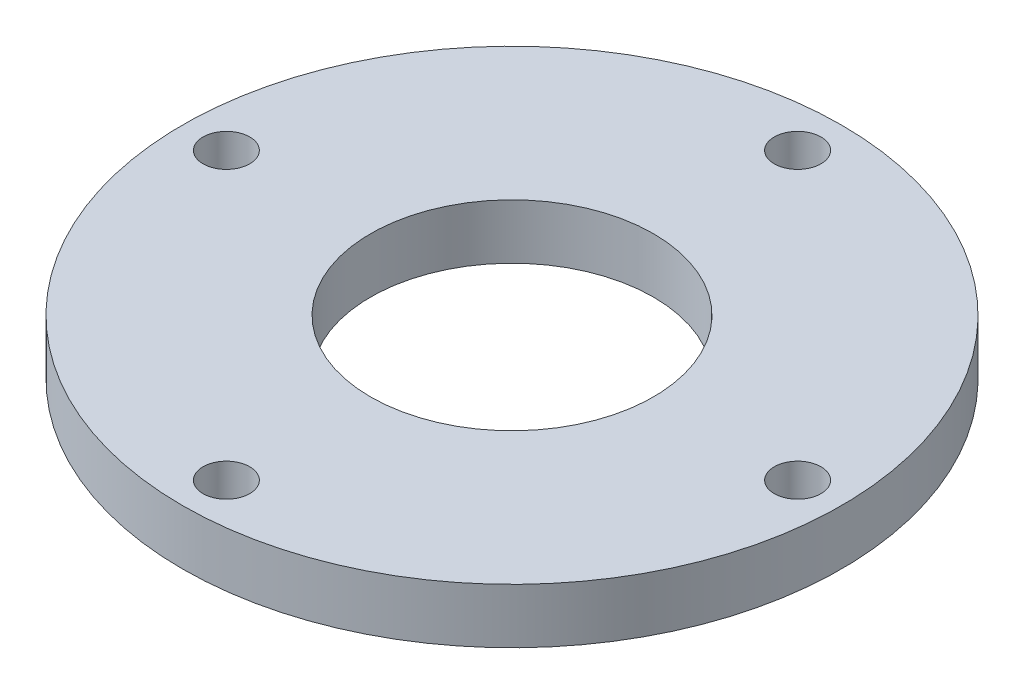
ISO-10303-21;
HEADER;
FILE_DESCRIPTION(('STEP AP214'),'2;1');
FILE_NAME('part.step','',(''),(''),'','','');
FILE_SCHEMA(('AUTOMOTIVE_DESIGN { 1 0 10303 214 1 1 1 1 }'));
ENDSEC;
DATA;
#1=APPLICATION_CONTEXT('core data for automotive mechanical design processes');
#2=APPLICATION_PROTOCOL_DEFINITION('international standard','automotive_design',2000,#1);
#3=PRODUCT_CONTEXT('',#1,'mechanical');
#4=PRODUCT('Part','Part','',(#3));
#5=PRODUCT_RELATED_PRODUCT_CATEGORY('part','',(#4));
#6=PRODUCT_DEFINITION_FORMATION('','',#4);
#7=PRODUCT_DEFINITION_CONTEXT('part definition',#1,'design');
#8=PRODUCT_DEFINITION('design','',#6,#7);
#9=PRODUCT_DEFINITION_SHAPE('','',#8);
#10=(LENGTH_UNIT() NAMED_UNIT(*) SI_UNIT(.MILLI.,.METRE.));
#11=(NAMED_UNIT(*) PLANE_ANGLE_UNIT() SI_UNIT($,.RADIAN.));
#12=(NAMED_UNIT(*) SI_UNIT($,.STERADIAN.) SOLID_ANGLE_UNIT());
#13=UNCERTAINTY_MEASURE_WITH_UNIT(LENGTH_MEASURE(1.E-05),#10,'distance_accuracy_value','');
#14=(GEOMETRIC_REPRESENTATION_CONTEXT(3) GLOBAL_UNCERTAINTY_ASSIGNED_CONTEXT((#13)) GLOBAL_UNIT_ASSIGNED_CONTEXT((#10,
#11,#12)) REPRESENTATION_CONTEXT('',''));
#15=CARTESIAN_POINT('',(0.,0.,0.));
#16=DIRECTION('',(0.,0.,1.));
#17=DIRECTION('',(1.,0.,0.));
#18=AXIS2_PLACEMENT_3D('',#15,#16,#17);
#19=CARTESIAN_POINT('',(0.,4.,0.));
#20=DIRECTION('',(0.,1.,0.));
#21=DIRECTION('',(0.,0.,1.));
#22=AXIS2_PLACEMENT_3D('',#19,#20,#21);
#23=PLANE('',#22);
#24=CARTESIAN_POINT('',(-20.8,4.,0.));
#25=DIRECTION('',(0.,1.,0.));
#26=DIRECTION('',(0.,0.,1.));
#27=AXIS2_PLACEMENT_3D('',#24,#25,#26);
#28=CIRCLE('',#27,1.7);
#29=CARTESIAN_POINT('',(-20.8,4.,1.7));
#30=VERTEX_POINT('',#29);
#31=EDGE_CURVE('E76',#30,#30,#28,.T.);
#32=ORIENTED_EDGE('',*,*,#31,.F.);
#33=EDGE_LOOP('',(#32));
#34=FACE_BOUND('',#33,.T.);
#35=CARTESIAN_POINT('',(0.,4.,-20.8));
#36=DIRECTION('',(0.,1.,0.));
#37=DIRECTION('',(0.,0.,1.));
#38=AXIS2_PLACEMENT_3D('',#35,#36,#37);
#39=CIRCLE('',#38,1.7);
#40=CARTESIAN_POINT('',(0.,4.,-19.1));
#41=VERTEX_POINT('',#40);
#42=EDGE_CURVE('E73',#41,#41,#39,.T.);
#43=ORIENTED_EDGE('',*,*,#42,.F.);
#44=EDGE_LOOP('',(#43));
#45=FACE_BOUND('',#44,.T.);
#46=CARTESIAN_POINT('',(20.8,4.,0.));
#47=DIRECTION('',(0.,1.,0.));
#48=DIRECTION('',(0.,0.,1.));
#49=AXIS2_PLACEMENT_3D('',#46,#47,#48);
#50=CIRCLE('',#49,1.7);
#51=CARTESIAN_POINT('',(20.8,4.,1.7));
#52=VERTEX_POINT('',#51);
#53=EDGE_CURVE('E67',#52,#52,#50,.T.);
#54=ORIENTED_EDGE('',*,*,#53,.F.);
#55=EDGE_LOOP('',(#54));
#56=FACE_BOUND('',#55,.T.);
#57=CARTESIAN_POINT('',(0.,4.,20.8));
#58=DIRECTION('',(0.,1.,0.));
#59=DIRECTION('',(0.,0.,1.));
#60=AXIS2_PLACEMENT_3D('',#57,#58,#59);
#61=CIRCLE('',#60,1.7);
#62=CARTESIAN_POINT('',(0.,4.,22.5));
#63=VERTEX_POINT('',#62);
#64=EDGE_CURVE('E61',#63,#63,#61,.T.);
#65=ORIENTED_EDGE('',*,*,#64,.F.);
#66=EDGE_LOOP('',(#65));
#67=FACE_BOUND('',#66,.T.);
#68=CARTESIAN_POINT('',(0.,4.,0.));
#69=DIRECTION('',(0.,1.,0.));
#70=DIRECTION('',(0.,0.,1.));
#71=AXIS2_PLACEMENT_3D('',#68,#69,#70);
#72=CIRCLE('',#71,24.);
#73=CARTESIAN_POINT('',(0.,4.,24.));
#74=VERTEX_POINT('',#73);
#75=EDGE_CURVE('E10',#74,#74,#72,.T.);
#76=ORIENTED_EDGE('',*,*,#75,.T.);
#77=EDGE_LOOP('',(#76));
#78=FACE_BOUND('',#77,.T.);
#79=CARTESIAN_POINT('',(0.,4.,0.));
#80=DIRECTION('',(0.,1.,0.));
#81=DIRECTION('',(0.,0.,1.));
#82=AXIS2_PLACEMENT_3D('',#79,#80,#81);
#83=CIRCLE('',#82,10.3);
#84=CARTESIAN_POINT('',(0.,4.,10.3));
#85=VERTEX_POINT('',#84);
#86=EDGE_CURVE('E50',#85,#85,#83,.T.);
#87=ORIENTED_EDGE('',*,*,#86,.F.);
#88=EDGE_LOOP('',(#87));
#89=FACE_BOUND('',#88,.T.);
#90=ADVANCED_FACE('F39',(#34,#45,#56,#67,#78,#89),#23,.T.);
#91=CARTESIAN_POINT('',(0.,0.,0.));
#92=DIRECTION('',(0.,1.,0.));
#93=DIRECTION('',(0.,0.,1.));
#94=AXIS2_PLACEMENT_3D('',#91,#92,#93);
#95=PLANE('',#94);
#96=CARTESIAN_POINT('',(-20.8,0.,0.));
#97=DIRECTION('',(0.,1.,0.));
#98=DIRECTION('',(0.,0.,1.));
#99=AXIS2_PLACEMENT_3D('',#96,#97,#98);
#100=CIRCLE('',#99,1.7);
#101=CARTESIAN_POINT('',(-20.8,0.,1.7));
#102=VERTEX_POINT('',#101);
#103=EDGE_CURVE('E55',#102,#102,#100,.T.);
#104=ORIENTED_EDGE('',*,*,#103,.T.);
#105=EDGE_LOOP('',(#104));
#106=FACE_BOUND('',#105,.T.);
#107=CARTESIAN_POINT('',(0.,0.,-20.8));
#108=DIRECTION('',(0.,1.,0.));
#109=DIRECTION('',(0.,0.,1.));
#110=AXIS2_PLACEMENT_3D('',#107,#108,#109);
#111=CIRCLE('',#110,1.7);
#112=CARTESIAN_POINT('',(0.,0.,-19.1));
#113=VERTEX_POINT('',#112);
#114=EDGE_CURVE('E70',#113,#113,#111,.T.);
#115=ORIENTED_EDGE('',*,*,#114,.T.);
#116=EDGE_LOOP('',(#115));
#117=FACE_BOUND('',#116,.T.);
#118=CARTESIAN_POINT('',(20.8,0.,0.));
#119=DIRECTION('',(0.,1.,0.));
#120=DIRECTION('',(0.,0.,1.));
#121=AXIS2_PLACEMENT_3D('',#118,#119,#120);
#122=CIRCLE('',#121,1.7);
#123=CARTESIAN_POINT('',(20.8,0.,1.7));
#124=VERTEX_POINT('',#123);
#125=EDGE_CURVE('E64',#124,#124,#122,.T.);
#126=ORIENTED_EDGE('',*,*,#125,.T.);
#127=EDGE_LOOP('',(#126));
#128=FACE_BOUND('',#127,.T.);
#129=CARTESIAN_POINT('',(0.,0.,20.8));
#130=DIRECTION('',(0.,1.,0.));
#131=DIRECTION('',(0.,0.,1.));
#132=AXIS2_PLACEMENT_3D('',#129,#130,#131);
#133=CIRCLE('',#132,1.7);
#134=CARTESIAN_POINT('',(0.,0.,22.5));
#135=VERTEX_POINT('',#134);
#136=EDGE_CURVE('E58',#135,#135,#133,.T.);
#137=ORIENTED_EDGE('',*,*,#136,.T.);
#138=EDGE_LOOP('',(#137));
#139=FACE_BOUND('',#138,.T.);
#140=CARTESIAN_POINT('',(0.,0.,0.));
#141=DIRECTION('',(0.,1.,0.));
#142=DIRECTION('',(0.,0.,1.));
#143=AXIS2_PLACEMENT_3D('',#140,#141,#142);
#144=CIRCLE('',#143,24.);
#145=CARTESIAN_POINT('',(0.,0.,24.));
#146=VERTEX_POINT('',#145);
#147=EDGE_CURVE('E43',#146,#146,#144,.T.);
#148=ORIENTED_EDGE('',*,*,#147,.F.);
#149=EDGE_LOOP('',(#148));
#150=FACE_BOUND('',#149,.T.);
#151=CARTESIAN_POINT('',(0.,0.,0.));
#152=DIRECTION('',(0.,1.,0.));
#153=DIRECTION('',(0.,0.,1.));
#154=AXIS2_PLACEMENT_3D('',#151,#152,#153);
#155=CIRCLE('',#154,10.3);
#156=CARTESIAN_POINT('',(0.,0.,10.3));
#157=VERTEX_POINT('',#156);
#158=EDGE_CURVE('E52',#157,#157,#155,.T.);
#159=ORIENTED_EDGE('',*,*,#158,.T.);
#160=EDGE_LOOP('',(#159));
#161=FACE_BOUND('',#160,.T.);
#162=ADVANCED_FACE('F82',(#106,#117,#128,#139,#150,#161),#95,.F.);
#163=CARTESIAN_POINT('',(0.,4.,0.));
#164=DIRECTION('',(0.,-1.,0.));
#165=DIRECTION('',(0.,0.,-1.));
#166=AXIS2_PLACEMENT_3D('',#163,#164,#165);
#167=CYLINDRICAL_SURFACE('',#166,24.);
#168=ORIENTED_EDGE('',*,*,#75,.F.);
#169=EDGE_LOOP('',(#168));
#170=FACE_BOUND('',#169,.T.);
#171=ORIENTED_EDGE('',*,*,#147,.T.);
#172=EDGE_LOOP('',(#171));
#173=FACE_BOUND('',#172,.T.);
#174=ADVANCED_FACE('F41',(#170,#173),#167,.T.);
#175=CARTESIAN_POINT('',(0.,4.,0.));
#176=DIRECTION('',(0.,-1.,0.));
#177=DIRECTION('',(0.,0.,-1.));
#178=AXIS2_PLACEMENT_3D('',#175,#176,#177);
#179=CYLINDRICAL_SURFACE('',#178,10.3);
#180=ORIENTED_EDGE('',*,*,#86,.T.);
#181=EDGE_LOOP('',(#180));
#182=FACE_BOUND('',#181,.T.);
#183=ORIENTED_EDGE('',*,*,#158,.F.);
#184=EDGE_LOOP('',(#183));
#185=FACE_BOUND('',#184,.T.);
#186=ADVANCED_FACE('F103',(#182,#185),#179,.F.);
#187=CARTESIAN_POINT('',(0.,0.,20.8));
#188=DIRECTION('',(0.,1.,0.));
#189=DIRECTION('',(0.,0.,1.));
#190=AXIS2_PLACEMENT_3D('',#187,#188,#189);
#191=CYLINDRICAL_SURFACE('',#190,1.7);
#192=ORIENTED_EDGE('',*,*,#136,.F.);
#193=EDGE_LOOP('',(#192));
#194=FACE_BOUND('',#193,.T.);
#195=ORIENTED_EDGE('',*,*,#64,.T.);
#196=EDGE_LOOP('',(#195));
#197=FACE_BOUND('',#196,.T.);
#198=ADVANCED_FACE('F106',(#194,#197),#191,.F.);
#199=CARTESIAN_POINT('',(20.8,0.,0.));
#200=DIRECTION('',(0.,1.,0.));
#201=DIRECTION('',(0.,0.,1.));
#202=AXIS2_PLACEMENT_3D('',#199,#200,#201);
#203=CYLINDRICAL_SURFACE('',#202,1.7);
#204=ORIENTED_EDGE('',*,*,#125,.F.);
#205=EDGE_LOOP('',(#204));
#206=FACE_BOUND('',#205,.T.);
#207=ORIENTED_EDGE('',*,*,#53,.T.);
#208=EDGE_LOOP('',(#207));
#209=FACE_BOUND('',#208,.T.);
#210=ADVANCED_FACE('F118',(#206,#209),#203,.F.);
#211=CARTESIAN_POINT('',(0.,0.,-20.8));
#212=DIRECTION('',(0.,1.,0.));
#213=DIRECTION('',(0.,0.,1.));
#214=AXIS2_PLACEMENT_3D('',#211,#212,#213);
#215=CYLINDRICAL_SURFACE('',#214,1.7);
#216=ORIENTED_EDGE('',*,*,#114,.F.);
#217=EDGE_LOOP('',(#216));
#218=FACE_BOUND('',#217,.T.);
#219=ORIENTED_EDGE('',*,*,#42,.T.);
#220=EDGE_LOOP('',(#219));
#221=FACE_BOUND('',#220,.T.);
#222=ADVANCED_FACE('F88',(#218,#221),#215,.F.);
#223=CARTESIAN_POINT('',(-20.8,0.,0.));
#224=DIRECTION('',(0.,1.,0.));
#225=DIRECTION('',(0.,0.,1.));
#226=AXIS2_PLACEMENT_3D('',#223,#224,#225);
#227=CYLINDRICAL_SURFACE('',#226,1.7);
#228=ORIENTED_EDGE('',*,*,#103,.F.);
#229=EDGE_LOOP('',(#228));
#230=FACE_BOUND('',#229,.T.);
#231=ORIENTED_EDGE('',*,*,#31,.T.);
#232=EDGE_LOOP('',(#231));
#233=FACE_BOUND('',#232,.T.);
#234=ADVANCED_FACE('F85',(#230,#233),#227,.F.);
#235=CLOSED_SHELL('',(#90,#162,#174,#186,#198,#210,#222,#234));
#236=MANIFOLD_SOLID_BREP('B2',#235);
#237=ADVANCED_BREP_SHAPE_REPRESENTATION('',(#18,#236),#14);
#238=SHAPE_DEFINITION_REPRESENTATION(#9,#237);
ENDSEC;
END-ISO-10303-21;
